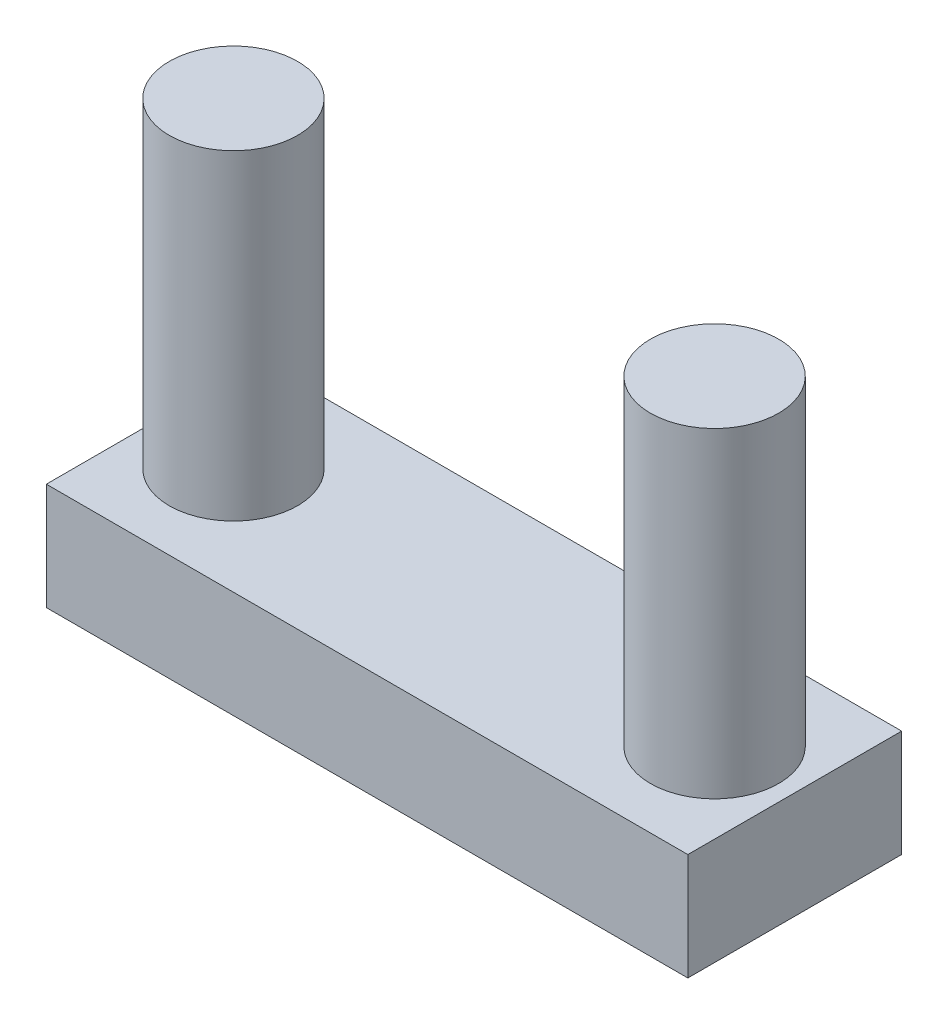
ISO-10303-21;
HEADER;
FILE_DESCRIPTION(('STEP AP214'),'2;1');
FILE_NAME('part.step','',(''),(''),'','','');
FILE_SCHEMA(('AUTOMOTIVE_DESIGN { 1 0 10303 214 1 1 1 1 }'));
ENDSEC;
DATA;
#1=APPLICATION_CONTEXT('core data for automotive mechanical design processes');
#2=APPLICATION_PROTOCOL_DEFINITION('international standard','automotive_design',2000,#1);
#3=PRODUCT_CONTEXT('',#1,'mechanical');
#4=PRODUCT('Part','Part','',(#3));
#5=PRODUCT_RELATED_PRODUCT_CATEGORY('part','',(#4));
#6=PRODUCT_DEFINITION_FORMATION('','',#4);
#7=PRODUCT_DEFINITION_CONTEXT('part definition',#1,'design');
#8=PRODUCT_DEFINITION('design','',#6,#7);
#9=PRODUCT_DEFINITION_SHAPE('','',#8);
#10=(LENGTH_UNIT() NAMED_UNIT(*) SI_UNIT(.MILLI.,.METRE.));
#11=(NAMED_UNIT(*) PLANE_ANGLE_UNIT() SI_UNIT($,.RADIAN.));
#12=(NAMED_UNIT(*) SI_UNIT($,.STERADIAN.) SOLID_ANGLE_UNIT());
#13=UNCERTAINTY_MEASURE_WITH_UNIT(LENGTH_MEASURE(1.E-05),#10,'distance_accuracy_value','');
#14=(GEOMETRIC_REPRESENTATION_CONTEXT(3) GLOBAL_UNCERTAINTY_ASSIGNED_CONTEXT((#13)) GLOBAL_UNIT_ASSIGNED_CONTEXT((#10,
#11,#12)) REPRESENTATION_CONTEXT('',''));
#15=CARTESIAN_POINT('',(0.,0.,0.));
#16=DIRECTION('',(0.,0.,1.));
#17=DIRECTION('',(1.,0.,0.));
#18=AXIS2_PLACEMENT_3D('',#15,#16,#17);
#19=CARTESIAN_POINT('',(0.,5.,0.));
#20=DIRECTION('',(0.,1.,0.));
#21=DIRECTION('',(0.,0.,1.));
#22=AXIS2_PLACEMENT_3D('',#19,#20,#21);
#23=PLANE('',#22);
#24=CARTESIAN_POINT('',(0.,5.,0.));
#25=DIRECTION('',(0.,1.,0.));
#26=DIRECTION('',(0.,0.,1.));
#27=AXIS2_PLACEMENT_3D('',#24,#25,#26);
#28=CIRCLE('',#27,3.);
#29=CARTESIAN_POINT('',(0.,5.,3.));
#30=VERTEX_POINT('',#29);
#31=EDGE_CURVE('E118',#30,#30,#28,.T.);
#32=ORIENTED_EDGE('',*,*,#31,.F.);
#33=EDGE_LOOP('',(#32));
#34=FACE_BOUND('',#33,.T.);
#35=DIRECTION('',(0.,0.,1.));
#36=VECTOR('',#35,1.);
#37=CARTESIAN_POINT('',(-3.75,5.,-5.));
#38=LINE('',#37,#36);
#39=CARTESIAN_POINT('',(-3.75,5.,-5.));
#40=VERTEX_POINT('',#39);
#41=CARTESIAN_POINT('',(-3.75,5.,5.));
#42=VERTEX_POINT('',#41);
#43=EDGE_CURVE('E98',#40,#42,#38,.T.);
#44=ORIENTED_EDGE('',*,*,#43,.T.);
#45=DIRECTION('',(1.,0.,0.));
#46=VECTOR('',#45,1.);
#47=CARTESIAN_POINT('',(-3.75,5.,5.));
#48=LINE('',#47,#46);
#49=CARTESIAN_POINT('',(26.25,5.,5.));
#50=VERTEX_POINT('',#49);
#51=EDGE_CURVE('E93',#42,#50,#48,.T.);
#52=ORIENTED_EDGE('',*,*,#51,.T.);
#53=DIRECTION('',(0.,0.,-1.));
#54=VECTOR('',#53,1.);
#55=CARTESIAN_POINT('',(26.25,5.,-5.));
#56=LINE('',#55,#54);
#57=CARTESIAN_POINT('',(26.25,5.,-5.));
#58=VERTEX_POINT('',#57);
#59=EDGE_CURVE('E96',#50,#58,#56,.T.);
#60=ORIENTED_EDGE('',*,*,#59,.T.);
#61=DIRECTION('',(-1.,0.,0.));
#62=VECTOR('',#61,1.);
#63=CARTESIAN_POINT('',(-3.75,5.,-5.));
#64=LINE('',#63,#62);
#65=EDGE_CURVE('E63',#58,#40,#64,.T.);
#66=ORIENTED_EDGE('',*,*,#65,.T.);
#67=EDGE_LOOP('',(#44,#52,#60,#66));
#68=FACE_BOUND('',#67,.T.);
#69=CARTESIAN_POINT('',(22.5,5.,0.));
#70=DIRECTION('',(0.,1.,0.));
#71=DIRECTION('',(0.,0.,1.));
#72=AXIS2_PLACEMENT_3D('',#69,#70,#71);
#73=CIRCLE('',#72,3.);
#74=CARTESIAN_POINT('',(22.5,5.,3.));
#75=VERTEX_POINT('',#74);
#76=EDGE_CURVE('E138',#75,#75,#73,.T.);
#77=ORIENTED_EDGE('',*,*,#76,.F.);
#78=EDGE_LOOP('',(#77));
#79=FACE_BOUND('',#78,.T.);
#80=ADVANCED_FACE('F45',(#34,#68,#79),#23,.T.);
#81=CARTESIAN_POINT('',(0.,0.,0.));
#82=DIRECTION('',(0.,1.,0.));
#83=DIRECTION('',(0.,0.,1.));
#84=AXIS2_PLACEMENT_3D('',#81,#82,#83);
#85=PLANE('',#84);
#86=DIRECTION('',(0.,0.,1.));
#87=VECTOR('',#86,1.);
#88=CARTESIAN_POINT('',(-3.75,0.,-5.));
#89=LINE('',#88,#87);
#90=CARTESIAN_POINT('',(-3.75,0.,-5.));
#91=VERTEX_POINT('',#90);
#92=CARTESIAN_POINT('',(-3.75,0.,5.));
#93=VERTEX_POINT('',#92);
#94=EDGE_CURVE('E114',#91,#93,#89,.T.);
#95=ORIENTED_EDGE('',*,*,#94,.F.);
#96=DIRECTION('',(-1.,0.,0.));
#97=VECTOR('',#96,1.);
#98=CARTESIAN_POINT('',(-3.75,0.,-5.));
#99=LINE('',#98,#97);
#100=CARTESIAN_POINT('',(26.25,0.,-5.));
#101=VERTEX_POINT('',#100);
#102=EDGE_CURVE('E86',#101,#91,#99,.T.);
#103=ORIENTED_EDGE('',*,*,#102,.F.);
#104=DIRECTION('',(0.,0.,-1.));
#105=VECTOR('',#104,1.);
#106=CARTESIAN_POINT('',(26.25,0.,-5.));
#107=LINE('',#106,#105);
#108=CARTESIAN_POINT('',(26.25,0.,5.));
#109=VERTEX_POINT('',#108);
#110=EDGE_CURVE('E80',#109,#101,#107,.T.);
#111=ORIENTED_EDGE('',*,*,#110,.F.);
#112=DIRECTION('',(1.,0.,0.));
#113=VECTOR('',#112,1.);
#114=CARTESIAN_POINT('',(-3.75,0.,5.));
#115=LINE('',#114,#113);
#116=EDGE_CURVE('E103',#93,#109,#115,.T.);
#117=ORIENTED_EDGE('',*,*,#116,.F.);
#118=EDGE_LOOP('',(#95,#103,#111,#117));
#119=FACE_BOUND('',#118,.T.);
#120=ADVANCED_FACE('F131',(#119),#85,.F.);
#121=CARTESIAN_POINT('',(-3.75,5.,-5.));
#122=DIRECTION('',(1.,0.,0.));
#123=DIRECTION('',(0.,0.,-1.));
#124=AXIS2_PLACEMENT_3D('',#121,#122,#123);
#125=PLANE('',#124);
#126=ORIENTED_EDGE('',*,*,#94,.T.);
#127=DIRECTION('',(0.,-1.,0.));
#128=VECTOR('',#127,1.);
#129=CARTESIAN_POINT('',(-3.75,5.,5.));
#130=LINE('',#129,#128);
#131=EDGE_CURVE('E11',#42,#93,#130,.T.);
#132=ORIENTED_EDGE('',*,*,#131,.F.);
#133=ORIENTED_EDGE('',*,*,#43,.F.);
#134=DIRECTION('',(0.,-1.,0.));
#135=VECTOR('',#134,1.);
#136=CARTESIAN_POINT('',(-3.75,5.,-5.));
#137=LINE('',#136,#135);
#138=EDGE_CURVE('E110',#40,#91,#137,.T.);
#139=ORIENTED_EDGE('',*,*,#138,.T.);
#140=EDGE_LOOP('',(#126,#132,#133,#139));
#141=FACE_BOUND('',#140,.T.);
#142=ADVANCED_FACE('F47',(#141),#125,.F.);
#143=CARTESIAN_POINT('',(-3.75,5.,5.));
#144=DIRECTION('',(0.,0.,-1.));
#145=DIRECTION('',(-1.,0.,0.));
#146=AXIS2_PLACEMENT_3D('',#143,#144,#145);
#147=PLANE('',#146);
#148=ORIENTED_EDGE('',*,*,#116,.T.);
#149=DIRECTION('',(0.,-1.,0.));
#150=VECTOR('',#149,1.);
#151=CARTESIAN_POINT('',(26.25,5.,5.));
#152=LINE('',#151,#150);
#153=EDGE_CURVE('E55',#50,#109,#152,.T.);
#154=ORIENTED_EDGE('',*,*,#153,.F.);
#155=ORIENTED_EDGE('',*,*,#51,.F.);
#156=ORIENTED_EDGE('',*,*,#131,.T.);
#157=EDGE_LOOP('',(#148,#154,#155,#156));
#158=FACE_BOUND('',#157,.T.);
#159=ADVANCED_FACE('F102',(#158),#147,.F.);
#160=CARTESIAN_POINT('',(26.25,5.,-5.));
#161=DIRECTION('',(-1.,0.,0.));
#162=DIRECTION('',(0.,0.,1.));
#163=AXIS2_PLACEMENT_3D('',#160,#161,#162);
#164=PLANE('',#163);
#165=ORIENTED_EDGE('',*,*,#110,.T.);
#166=DIRECTION('',(0.,-1.,0.));
#167=VECTOR('',#166,1.);
#168=CARTESIAN_POINT('',(26.25,5.,-5.));
#169=LINE('',#168,#167);
#170=EDGE_CURVE('E105',#58,#101,#169,.T.);
#171=ORIENTED_EDGE('',*,*,#170,.F.);
#172=ORIENTED_EDGE('',*,*,#59,.F.);
#173=ORIENTED_EDGE('',*,*,#153,.T.);
#174=EDGE_LOOP('',(#165,#171,#172,#173));
#175=FACE_BOUND('',#174,.T.);
#176=ADVANCED_FACE('F106',(#175),#164,.F.);
#177=CARTESIAN_POINT('',(-3.75,5.,-5.));
#178=DIRECTION('',(0.,0.,1.));
#179=DIRECTION('',(1.,0.,0.));
#180=AXIS2_PLACEMENT_3D('',#177,#178,#179);
#181=PLANE('',#180);
#182=ORIENTED_EDGE('',*,*,#102,.T.);
#183=ORIENTED_EDGE('',*,*,#138,.F.);
#184=ORIENTED_EDGE('',*,*,#65,.F.);
#185=ORIENTED_EDGE('',*,*,#170,.T.);
#186=EDGE_LOOP('',(#182,#183,#184,#185));
#187=FACE_BOUND('',#186,.T.);
#188=ADVANCED_FACE('F128',(#187),#181,.F.);
#189=CARTESIAN_POINT('',(22.5,20.,0.));
#190=DIRECTION('',(0.,-1.,0.));
#191=DIRECTION('',(0.,0.,-1.));
#192=AXIS2_PLACEMENT_3D('',#189,#190,#191);
#193=CYLINDRICAL_SURFACE('',#192,3.);
#194=ORIENTED_EDGE('',*,*,#76,.T.);
#195=EDGE_LOOP('',(#194));
#196=FACE_BOUND('',#195,.T.);
#197=CARTESIAN_POINT('',(22.5,20.,0.));
#198=DIRECTION('',(0.,1.,0.));
#199=DIRECTION('',(0.,0.,1.));
#200=AXIS2_PLACEMENT_3D('',#197,#198,#199);
#201=CIRCLE('',#200,3.);
#202=CARTESIAN_POINT('',(22.5,20.,3.));
#203=VERTEX_POINT('',#202);
#204=EDGE_CURVE('E143',#203,#203,#201,.T.);
#205=ORIENTED_EDGE('',*,*,#204,.F.);
#206=EDGE_LOOP('',(#205));
#207=FACE_BOUND('',#206,.T.);
#208=ADVANCED_FACE('F163',(#196,#207),#193,.T.);
#209=CARTESIAN_POINT('',(0.,20.,0.));
#210=DIRECTION('',(0.,1.,0.));
#211=DIRECTION('',(0.,0.,1.));
#212=AXIS2_PLACEMENT_3D('',#209,#210,#211);
#213=PLANE('',#212);
#214=ORIENTED_EDGE('',*,*,#204,.T.);
#215=EDGE_LOOP('',(#214));
#216=FACE_BOUND('',#215,.T.);
#217=ADVANCED_FACE('F155',(#216),#213,.T.);
#218=CARTESIAN_POINT('',(0.,20.,0.));
#219=DIRECTION('',(0.,-1.,0.));
#220=DIRECTION('',(0.,0.,-1.));
#221=AXIS2_PLACEMENT_3D('',#218,#219,#220);
#222=CYLINDRICAL_SURFACE('',#221,3.);
#223=ORIENTED_EDGE('',*,*,#31,.T.);
#224=EDGE_LOOP('',(#223));
#225=FACE_BOUND('',#224,.T.);
#226=CARTESIAN_POINT('',(0.,20.,0.));
#227=DIRECTION('',(0.,1.,0.));
#228=DIRECTION('',(0.,0.,1.));
#229=AXIS2_PLACEMENT_3D('',#226,#227,#228);
#230=CIRCLE('',#229,3.);
#231=CARTESIAN_POINT('',(0.,20.,3.));
#232=VERTEX_POINT('',#231);
#233=EDGE_CURVE('E142',#232,#232,#230,.T.);
#234=ORIENTED_EDGE('',*,*,#233,.F.);
#235=EDGE_LOOP('',(#234));
#236=FACE_BOUND('',#235,.T.);
#237=ADVANCED_FACE('F153',(#225,#236),#222,.T.);
#238=CARTESIAN_POINT('',(0.,20.,0.));
#239=DIRECTION('',(0.,1.,0.));
#240=DIRECTION('',(0.,0.,1.));
#241=AXIS2_PLACEMENT_3D('',#238,#239,#240);
#242=PLANE('',#241);
#243=ORIENTED_EDGE('',*,*,#233,.T.);
#244=EDGE_LOOP('',(#243));
#245=FACE_BOUND('',#244,.T.);
#246=ADVANCED_FACE('F151',(#245),#242,.T.);
#247=CLOSED_SHELL('',(#80,#120,#142,#159,#176,#188,#208,#217,#237,#246));
#248=MANIFOLD_SOLID_BREP('B2',#247);
#249=ADVANCED_BREP_SHAPE_REPRESENTATION('',(#18,#248),#14);
#250=SHAPE_DEFINITION_REPRESENTATION(#9,#249);
ENDSEC;
END-ISO-10303-21;
